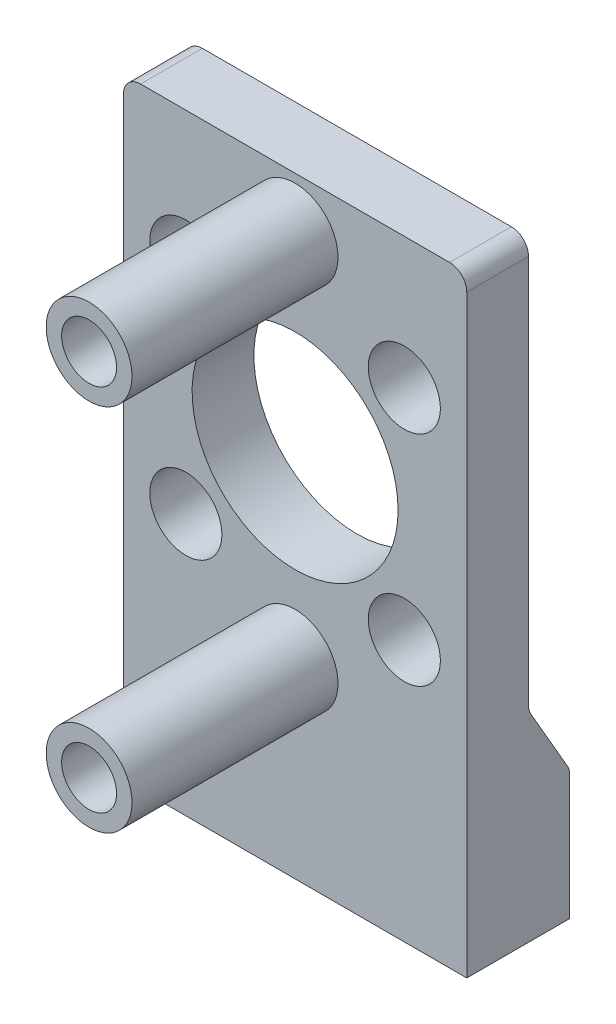
ISO-10303-21;
HEADER;
FILE_DESCRIPTION(('STEP AP214'),'2;1');
FILE_NAME('part.step','',(''),(''),'','','');
FILE_SCHEMA(('AUTOMOTIVE_DESIGN { 1 0 10303 214 1 1 1 1 }'));
ENDSEC;
DATA;
#1=APPLICATION_CONTEXT('core data for automotive mechanical design processes');
#2=APPLICATION_PROTOCOL_DEFINITION('international standard','automotive_design',2000,#1);
#3=PRODUCT_CONTEXT('',#1,'mechanical');
#4=PRODUCT('Part','Part','',(#3));
#5=PRODUCT_RELATED_PRODUCT_CATEGORY('part','',(#4));
#6=PRODUCT_DEFINITION_FORMATION('','',#4);
#7=PRODUCT_DEFINITION_CONTEXT('part definition',#1,'design');
#8=PRODUCT_DEFINITION('design','',#6,#7);
#9=PRODUCT_DEFINITION_SHAPE('','',#8);
#10=(LENGTH_UNIT() NAMED_UNIT(*) SI_UNIT(.MILLI.,.METRE.));
#11=(NAMED_UNIT(*) PLANE_ANGLE_UNIT() SI_UNIT($,.RADIAN.));
#12=(NAMED_UNIT(*) SI_UNIT($,.STERADIAN.) SOLID_ANGLE_UNIT());
#13=UNCERTAINTY_MEASURE_WITH_UNIT(LENGTH_MEASURE(1.E-05),#10,'distance_accuracy_value','');
#14=(GEOMETRIC_REPRESENTATION_CONTEXT(3) GLOBAL_UNCERTAINTY_ASSIGNED_CONTEXT((#13)) GLOBAL_UNIT_ASSIGNED_CONTEXT((#10,
#11,#12)) REPRESENTATION_CONTEXT('',''));
#15=CARTESIAN_POINT('',(0.,0.,0.));
#16=DIRECTION('',(0.,0.,1.));
#17=DIRECTION('',(1.,0.,0.));
#18=AXIS2_PLACEMENT_3D('',#15,#16,#17);
#19=CARTESIAN_POINT('',(-5.,-10.0827140549273,3.));
#20=DIRECTION('',(0.,1.,0.));
#21=DIRECTION('',(0.,0.,1.));
#22=AXIS2_PLACEMENT_3D('',#19,#20,#21);
#23=PLANE('',#22);
#24=CARTESIAN_POINT('',(-3.,-10.0827140549273,1.5));
#25=DIRECTION('',(0.,-1.,0.));
#26=DIRECTION('',(0.,0.,-1.));
#27=AXIS2_PLACEMENT_3D('',#24,#25,#26);
#28=CIRCLE('',#27,0.8);
#29=CARTESIAN_POINT('',(-3.,-10.0827140549273,0.7));
#30=VERTEX_POINT('',#29);
#31=EDGE_CURVE('E275',#30,#30,#28,.T.);
#32=ORIENTED_EDGE('',*,*,#31,.F.);
#33=EDGE_LOOP('',(#32));
#34=FACE_BOUND('',#33,.T.);
#35=DIRECTION('',(1.,0.,0.));
#36=VECTOR('',#35,1.);
#37=CARTESIAN_POINT('',(-5.,-10.0827140549273,0.));
#38=LINE('',#37,#36);
#39=CARTESIAN_POINT('',(-5.,-10.0827140549273,0.));
#40=VERTEX_POINT('',#39);
#41=CARTESIAN_POINT('',(5.,-10.0827140549273,0.));
#42=VERTEX_POINT('',#41);
#43=EDGE_CURVE('E236',#40,#42,#38,.T.);
#44=ORIENTED_EDGE('',*,*,#43,.T.);
#45=DIRECTION('',(0.,0.,-1.));
#46=VECTOR('',#45,1.);
#47=CARTESIAN_POINT('',(5.,-10.0827140549273,3.));
#48=LINE('',#47,#46);
#49=CARTESIAN_POINT('',(5.,-10.0827140549273,3.));
#50=VERTEX_POINT('',#49);
#51=EDGE_CURVE('E250',#50,#42,#48,.T.);
#52=ORIENTED_EDGE('',*,*,#51,.F.);
#53=DIRECTION('',(1.,0.,0.));
#54=VECTOR('',#53,1.);
#55=CARTESIAN_POINT('',(-5.,-10.0827140549273,3.));
#56=LINE('',#55,#54);
#57=CARTESIAN_POINT('',(-5.,-10.0827140549273,3.));
#58=VERTEX_POINT('',#57);
#59=EDGE_CURVE('E268',#58,#50,#56,.T.);
#60=ORIENTED_EDGE('',*,*,#59,.F.);
#61=DIRECTION('',(0.,0.,-1.));
#62=VECTOR('',#61,1.);
#63=CARTESIAN_POINT('',(-5.,-10.0827140549273,3.));
#64=LINE('',#63,#62);
#65=EDGE_CURVE('E253',#58,#40,#64,.T.);
#66=ORIENTED_EDGE('',*,*,#65,.T.);
#67=EDGE_LOOP('',(#44,#52,#60,#66));
#68=FACE_BOUND('',#67,.T.);
#69=CARTESIAN_POINT('',(3.,-10.0827140549273,1.5));
#70=DIRECTION('',(0.,1.,0.));
#71=DIRECTION('',(0.,0.,1.));
#72=AXIS2_PLACEMENT_3D('',#69,#70,#71);
#73=CIRCLE('',#72,0.8);
#74=CARTESIAN_POINT('',(3.,-10.0827140549273,2.3));
#75=VERTEX_POINT('',#74);
#76=EDGE_CURVE('E242',#75,#75,#73,.T.);
#77=ORIENTED_EDGE('',*,*,#76,.T.);
#78=EDGE_LOOP('',(#77));
#79=FACE_BOUND('',#78,.T.);
#80=ADVANCED_FACE('F41',(#34,#68,#79),#23,.F.);
#81=CARTESIAN_POINT('',(-5.,-9.78271405492731,3.));
#82=DIRECTION('',(1.,0.,0.));
#83=DIRECTION('',(0.,0.,-1.));
#84=AXIS2_PLACEMENT_3D('',#81,#82,#83);
#85=PLANE('',#84);
#86=DIRECTION('',(0.,-0.866025403784442,-0.499999999999995));
#87=VECTOR('',#86,1.);
#88=CARTESIAN_POINT('',(-5.,-4.24380333156708,1.2));
#89=LINE('',#88,#87);
#90=CARTESIAN_POINT('',(-5.,-4.35982873535151,1.13301270189222));
#91=VERTEX_POINT('',#90);
#92=CARTESIAN_POINT('',(-5.,-6.20623889686532,0.0669872981077782));
#93=VERTEX_POINT('',#92);
#94=EDGE_CURVE('E232',#91,#93,#89,.T.);
#95=ORIENTED_EDGE('',*,*,#94,.T.);
#96=CARTESIAN_POINT('',(-5.,-6.45623889686532,0.5));
#97=DIRECTION('',(1.,0.,0.));
#98=DIRECTION('',(0.,0.,-1.));
#99=AXIS2_PLACEMENT_3D('',#96,#97,#98);
#100=CIRCLE('',#99,0.5);
#101=CARTESIAN_POINT('',(-5.,-6.45623889686532,0.));
#102=VERTEX_POINT('',#101);
#103=EDGE_CURVE('E159',#93,#102,#100,.F.);
#104=ORIENTED_EDGE('',*,*,#103,.T.);
#105=DIRECTION('',(0.,-1.,0.));
#106=VECTOR('',#105,1.);
#107=CARTESIAN_POINT('',(-5.,-9.78271405492731,0.));
#108=LINE('',#107,#106);
#109=EDGE_CURVE('E230',#102,#40,#108,.T.);
#110=ORIENTED_EDGE('',*,*,#109,.T.);
#111=ORIENTED_EDGE('',*,*,#65,.F.);
#112=DIRECTION('',(0.,-1.,0.));
#113=VECTOR('',#112,1.);
#114=CARTESIAN_POINT('',(-5.,-9.78271405492731,3.));
#115=LINE('',#114,#113);
#116=CARTESIAN_POINT('',(-5.,7.2172859450727,3.));
#117=VERTEX_POINT('',#116);
#118=EDGE_CURVE('E249',#117,#58,#115,.T.);
#119=ORIENTED_EDGE('',*,*,#118,.F.);
#120=DIRECTION('',(0.,0.,-1.));
#121=VECTOR('',#120,1.);
#122=CARTESIAN_POINT('',(-5.,7.2172859450727,3.));
#123=LINE('',#122,#121);
#124=CARTESIAN_POINT('',(-5.,7.2172859450727,1.2));
#125=VERTEX_POINT('',#124);
#126=EDGE_CURVE('E255',#117,#125,#123,.T.);
#127=ORIENTED_EDGE('',*,*,#126,.T.);
#128=DIRECTION('',(0.,-1.,0.));
#129=VECTOR('',#128,1.);
#130=CARTESIAN_POINT('',(-5.,7.7172859450727,1.2));
#131=LINE('',#130,#129);
#132=CARTESIAN_POINT('',(-5.,-4.10982873535152,1.2));
#133=VERTEX_POINT('',#132);
#134=EDGE_CURVE('E313',#125,#133,#131,.T.);
#135=ORIENTED_EDGE('',*,*,#134,.T.);
#136=CARTESIAN_POINT('',(-5.,-4.10982873535152,0.699999999999998));
#137=DIRECTION('',(1.,0.,0.));
#138=DIRECTION('',(0.,0.,-1.));
#139=AXIS2_PLACEMENT_3D('',#136,#137,#138);
#140=CIRCLE('',#139,0.5);
#141=EDGE_CURVE('E163',#133,#91,#140,.T.);
#142=ORIENTED_EDGE('',*,*,#141,.T.);
#143=EDGE_LOOP('',(#95,#104,#110,#111,#119,#127,#135,#142));
#144=FACE_BOUND('',#143,.T.);
#145=ADVANCED_FACE('F195',(#144),#85,.F.);
#146=CARTESIAN_POINT('',(5.,-4.61241432740687,3.));
#147=DIRECTION('',(-1.,0.,0.));
#148=DIRECTION('',(0.,0.,1.));
#149=AXIS2_PLACEMENT_3D('',#146,#147,#148);
#150=PLANE('',#149);
#151=DIRECTION('',(0.,1.,0.));
#152=VECTOR('',#151,1.);
#153=CARTESIAN_POINT('',(5.,-4.61241432740687,0.));
#154=LINE('',#153,#152);
#155=CARTESIAN_POINT('',(5.,-6.45623889686532,0.));
#156=VERTEX_POINT('',#155);
#157=EDGE_CURVE('E239',#42,#156,#154,.T.);
#158=ORIENTED_EDGE('',*,*,#157,.T.);
#159=CARTESIAN_POINT('',(5.,-6.45623889686532,0.5));
#160=DIRECTION('',(-1.,0.,0.));
#161=DIRECTION('',(0.,0.,1.));
#162=AXIS2_PLACEMENT_3D('',#159,#160,#161);
#163=CIRCLE('',#162,0.5);
#164=CARTESIAN_POINT('',(5.,-6.20623889686532,0.0669872981077782));
#165=VERTEX_POINT('',#164);
#166=EDGE_CURVE('E153',#156,#165,#163,.F.);
#167=ORIENTED_EDGE('',*,*,#166,.T.);
#168=DIRECTION('',(0.,-0.866025403784442,-0.499999999999995));
#169=VECTOR('',#168,1.);
#170=CARTESIAN_POINT('',(5.,-4.24380333156708,1.2));
#171=LINE('',#170,#169);
#172=CARTESIAN_POINT('',(5.,-4.35982873535151,1.13301270189222));
#173=VERTEX_POINT('',#172);
#174=EDGE_CURVE('E140',#173,#165,#171,.T.);
#175=ORIENTED_EDGE('',*,*,#174,.F.);
#176=CARTESIAN_POINT('',(5.,-4.10982873535152,0.699999999999998));
#177=DIRECTION('',(-1.,0.,0.));
#178=DIRECTION('',(0.,0.,1.));
#179=AXIS2_PLACEMENT_3D('',#176,#177,#178);
#180=CIRCLE('',#179,0.5);
#181=CARTESIAN_POINT('',(5.,-4.10982873535152,1.2));
#182=VERTEX_POINT('',#181);
#183=EDGE_CURVE('E139',#173,#182,#180,.T.);
#184=ORIENTED_EDGE('',*,*,#183,.T.);
#185=DIRECTION('',(0.,-1.,0.));
#186=VECTOR('',#185,1.);
#187=CARTESIAN_POINT('',(5.,7.7172859450727,1.2));
#188=LINE('',#187,#186);
#189=CARTESIAN_POINT('',(5.,7.2172859450727,1.2));
#190=VERTEX_POINT('',#189);
#191=EDGE_CURVE('E123',#190,#182,#188,.T.);
#192=ORIENTED_EDGE('',*,*,#191,.F.);
#193=DIRECTION('',(0.,0.,-1.));
#194=VECTOR('',#193,1.);
#195=CARTESIAN_POINT('',(5.,7.2172859450727,3.));
#196=LINE('',#195,#194);
#197=CARTESIAN_POINT('',(5.,7.2172859450727,3.));
#198=VERTEX_POINT('',#197);
#199=EDGE_CURVE('E131',#190,#198,#196,.F.);
#200=ORIENTED_EDGE('',*,*,#199,.T.);
#201=DIRECTION('',(0.,1.,0.));
#202=VECTOR('',#201,1.);
#203=CARTESIAN_POINT('',(5.,-10.0827140549273,3.));
#204=LINE('',#203,#202);
#205=EDGE_CURVE('E265',#50,#198,#204,.T.);
#206=ORIENTED_EDGE('',*,*,#205,.F.);
#207=ORIENTED_EDGE('',*,*,#51,.T.);
#208=EDGE_LOOP('',(#158,#167,#175,#184,#192,#200,#206,#207));
#209=FACE_BOUND('',#208,.T.);
#210=ADVANCED_FACE('F135',(#209),#150,.F.);
#211=CARTESIAN_POINT('',(5.,7.7172859450727,3.));
#212=DIRECTION('',(0.,-1.,0.));
#213=DIRECTION('',(1.,0.,0.));
#214=AXIS2_PLACEMENT_3D('',#211,#212,#213);
#215=PLANE('',#214);
#216=DIRECTION('',(0.,0.,-1.));
#217=VECTOR('',#216,1.);
#218=CARTESIAN_POINT('',(4.5,7.7172859450727,3.));
#219=LINE('',#218,#217);
#220=CARTESIAN_POINT('',(4.5,7.7172859450727,3.));
#221=VERTEX_POINT('',#220);
#222=CARTESIAN_POINT('',(4.5,7.7172859450727,1.2));
#223=VERTEX_POINT('',#222);
#224=EDGE_CURVE('E258',#221,#223,#219,.T.);
#225=ORIENTED_EDGE('',*,*,#224,.T.);
#226=DIRECTION('',(1.,0.,0.));
#227=VECTOR('',#226,1.);
#228=CARTESIAN_POINT('',(-5.,7.7172859450727,1.2));
#229=LINE('',#228,#227);
#230=CARTESIAN_POINT('',(-4.5,7.7172859450727,1.2));
#231=VERTEX_POINT('',#230);
#232=EDGE_CURVE('E125',#231,#223,#229,.T.);
#233=ORIENTED_EDGE('',*,*,#232,.F.);
#234=DIRECTION('',(0.,0.,-1.));
#235=VECTOR('',#234,1.);
#236=CARTESIAN_POINT('',(-4.5,7.7172859450727,3.));
#237=LINE('',#236,#235);
#238=CARTESIAN_POINT('',(-4.5,7.7172859450727,3.));
#239=VERTEX_POINT('',#238);
#240=EDGE_CURVE('E260',#231,#239,#237,.F.);
#241=ORIENTED_EDGE('',*,*,#240,.T.);
#242=DIRECTION('',(-1.,0.,0.));
#243=VECTOR('',#242,1.);
#244=CARTESIAN_POINT('',(5.,7.7172859450727,3.));
#245=LINE('',#244,#243);
#246=EDGE_CURVE('E245',#221,#239,#245,.T.);
#247=ORIENTED_EDGE('',*,*,#246,.F.);
#248=EDGE_LOOP('',(#225,#233,#241,#247));
#249=FACE_BOUND('',#248,.T.);
#250=ADVANCED_FACE('F189',(#249),#215,.F.);
#251=CARTESIAN_POINT('',(0.,0.,3.));
#252=DIRECTION('',(0.,0.,1.));
#253=DIRECTION('',(1.,0.,0.));
#254=AXIS2_PLACEMENT_3D('',#251,#252,#253);
#255=PLANE('',#254);
#256=CARTESIAN_POINT('',(0.,6.2172859450727,3.));
#257=DIRECTION('',(0.,0.,1.));
#258=DIRECTION('',(1.,0.,0.));
#259=AXIS2_PLACEMENT_3D('',#256,#257,#258);
#260=CIRCLE('',#259,1.25);
#261=CARTESIAN_POINT('',(1.25,6.2172859450727,3.));
#262=VERTEX_POINT('',#261);
#263=EDGE_CURVE('E327',#262,#262,#260,.T.);
#264=ORIENTED_EDGE('',*,*,#263,.F.);
#265=EDGE_LOOP('',(#264));
#266=FACE_BOUND('',#265,.T.);
#267=CARTESIAN_POINT('',(0.,-4.5327140549273,3.));
#268=DIRECTION('',(0.,0.,1.));
#269=DIRECTION('',(1.,0.,0.));
#270=AXIS2_PLACEMENT_3D('',#267,#268,#269);
#271=CIRCLE('',#270,1.25);
#272=CARTESIAN_POINT('',(1.25,-4.5327140549273,3.));
#273=VERTEX_POINT('',#272);
#274=EDGE_CURVE('E321',#273,#273,#271,.T.);
#275=ORIENTED_EDGE('',*,*,#274,.F.);
#276=EDGE_LOOP('',(#275));
#277=FACE_BOUND('',#276,.T.);
#278=CARTESIAN_POINT('',(3.1819805153394,-2.46469457026674,3.));
#279=DIRECTION('',(0.,0.,1.));
#280=DIRECTION('',(1.,0.,0.));
#281=AXIS2_PLACEMENT_3D('',#278,#279,#280);
#282=CIRCLE('',#281,1.05);
#283=CARTESIAN_POINT('',(4.2319805153394,-2.46469457026674,3.));
#284=VERTEX_POINT('',#283);
#285=EDGE_CURVE('E276',#284,#284,#282,.T.);
#286=ORIENTED_EDGE('',*,*,#285,.F.);
#287=EDGE_LOOP('',(#286));
#288=FACE_BOUND('',#287,.T.);
#289=CARTESIAN_POINT('',(-3.18198051533954,-2.46469457026669,3.));
#290=DIRECTION('',(0.,0.,1.));
#291=DIRECTION('',(1.,0.,0.));
#292=AXIS2_PLACEMENT_3D('',#289,#290,#291);
#293=CIRCLE('',#292,1.05);
#294=CARTESIAN_POINT('',(-2.13198051533954,-2.46469457026669,3.));
#295=VERTEX_POINT('',#294);
#296=EDGE_CURVE('E283',#295,#295,#293,.T.);
#297=ORIENTED_EDGE('',*,*,#296,.F.);
#298=EDGE_LOOP('',(#297));
#299=FACE_BOUND('',#298,.T.);
#300=CARTESIAN_POINT('',(-3.1819805153394,3.89926646041213,3.));
#301=DIRECTION('',(0.,0.,1.));
#302=DIRECTION('',(1.,0.,0.));
#303=AXIS2_PLACEMENT_3D('',#300,#301,#302);
#304=CIRCLE('',#303,1.05000000000001);
#305=CARTESIAN_POINT('',(-2.13198051533939,3.89926646041213,3.));
#306=VERTEX_POINT('',#305);
#307=EDGE_CURVE('E286',#306,#306,#304,.T.);
#308=ORIENTED_EDGE('',*,*,#307,.F.);
#309=EDGE_LOOP('',(#308));
#310=FACE_BOUND('',#309,.T.);
#311=CARTESIAN_POINT('',(3.18198051533947,3.89926646041216,3.));
#312=DIRECTION('',(0.,0.,1.));
#313=DIRECTION('',(1.,0.,0.));
#314=AXIS2_PLACEMENT_3D('',#311,#312,#313);
#315=CIRCLE('',#314,1.05);
#316=CARTESIAN_POINT('',(4.23198051533947,3.89926646041216,3.));
#317=VERTEX_POINT('',#316);
#318=EDGE_CURVE('E289',#317,#317,#315,.T.);
#319=ORIENTED_EDGE('',*,*,#318,.F.);
#320=EDGE_LOOP('',(#319));
#321=FACE_BOUND('',#320,.T.);
#322=CARTESIAN_POINT('',(0.,0.717285945072699,3.));
#323=DIRECTION('',(0.,0.,1.));
#324=DIRECTION('',(1.,0.,0.));
#325=AXIS2_PLACEMENT_3D('',#322,#323,#324);
#326=CIRCLE('',#325,3.);
#327=CARTESIAN_POINT('',(3.,0.717285945072699,3.));
#328=VERTEX_POINT('',#327);
#329=EDGE_CURVE('E292',#328,#328,#326,.T.);
#330=ORIENTED_EDGE('',*,*,#329,.F.);
#331=EDGE_LOOP('',(#330));
#332=FACE_BOUND('',#331,.T.);
#333=ORIENTED_EDGE('',*,*,#246,.T.);
#334=CARTESIAN_POINT('',(-4.5,7.2172859450727,3.));
#335=DIRECTION('',(0.,0.,1.));
#336=DIRECTION('',(1.,0.,0.));
#337=AXIS2_PLACEMENT_3D('',#334,#335,#336);
#338=CIRCLE('',#337,0.5);
#339=EDGE_CURVE('E146',#239,#117,#338,.T.);
#340=ORIENTED_EDGE('',*,*,#339,.T.);
#341=ORIENTED_EDGE('',*,*,#118,.T.);
#342=ORIENTED_EDGE('',*,*,#59,.T.);
#343=ORIENTED_EDGE('',*,*,#205,.T.);
#344=CARTESIAN_POINT('',(4.5,7.2172859450727,3.));
#345=DIRECTION('',(0.,0.,1.));
#346=DIRECTION('',(1.,0.,0.));
#347=AXIS2_PLACEMENT_3D('',#344,#345,#346);
#348=CIRCLE('',#347,0.5);
#349=EDGE_CURVE('E145',#198,#221,#348,.T.);
#350=ORIENTED_EDGE('',*,*,#349,.T.);
#351=EDGE_LOOP('',(#333,#340,#341,#342,#343,#350));
#352=FACE_BOUND('',#351,.T.);
#353=ADVANCED_FACE('F173',(#266,#277,#288,#299,#310,#321,#332,#352),#255,.T.);
#354=CARTESIAN_POINT('',(0.,0.,0.));
#355=DIRECTION('',(0.,0.,1.));
#356=DIRECTION('',(1.,0.,0.));
#357=AXIS2_PLACEMENT_3D('',#354,#355,#356);
#358=PLANE('',#357);
#359=ORIENTED_EDGE('',*,*,#109,.F.);
#360=DIRECTION('',(1.,0.,0.));
#361=VECTOR('',#360,1.);
#362=CARTESIAN_POINT('',(0.,-6.45623889686532,0.));
#363=LINE('',#362,#361);
#364=EDGE_CURVE('E130',#102,#156,#363,.T.);
#365=ORIENTED_EDGE('',*,*,#364,.T.);
#366=ORIENTED_EDGE('',*,*,#157,.F.);
#367=ORIENTED_EDGE('',*,*,#43,.F.);
#368=EDGE_LOOP('',(#359,#365,#366,#367));
#369=FACE_BOUND('',#368,.T.);
#370=ADVANCED_FACE('F188',(#369),#358,.F.);
#371=CARTESIAN_POINT('',(-3.,-6.5827140549273,1.5));
#372=DIRECTION('',(0.,-1.,0.));
#373=DIRECTION('',(0.,0.,-1.));
#374=AXIS2_PLACEMENT_3D('',#371,#372,#373);
#375=CYLINDRICAL_SURFACE('',#374,0.8);
#376=CARTESIAN_POINT('',(-3.,-6.5827140549273,1.5));
#377=DIRECTION('',(0.,-1.,0.));
#378=DIRECTION('',(0.,0.,-1.));
#379=AXIS2_PLACEMENT_3D('',#376,#377,#378);
#380=CIRCLE('',#379,0.8);
#381=CARTESIAN_POINT('',(-3.,-6.5827140549273,0.7));
#382=VERTEX_POINT('',#381);
#383=EDGE_CURVE('E272',#382,#382,#380,.T.);
#384=ORIENTED_EDGE('',*,*,#383,.F.);
#385=EDGE_LOOP('',(#384));
#386=FACE_BOUND('',#385,.T.);
#387=ORIENTED_EDGE('',*,*,#31,.T.);
#388=EDGE_LOOP('',(#387));
#389=FACE_BOUND('',#388,.T.);
#390=ADVANCED_FACE('F383',(#386,#389),#375,.F.);
#391=CARTESIAN_POINT('',(-3.,-6.5827140549273,1.5));
#392=DIRECTION('',(0.,-1.,0.));
#393=DIRECTION('',(0.,0.,-1.));
#394=AXIS2_PLACEMENT_3D('',#391,#392,#393);
#395=PLANE('',#394);
#396=ORIENTED_EDGE('',*,*,#383,.T.);
#397=EDGE_LOOP('',(#396));
#398=FACE_BOUND('',#397,.T.);
#399=ADVANCED_FACE('F381',(#398),#395,.T.);
#400=CARTESIAN_POINT('',(3.,-6.5827140549273,1.5));
#401=DIRECTION('',(0.,-1.,0.));
#402=DIRECTION('',(0.,0.,-1.));
#403=AXIS2_PLACEMENT_3D('',#400,#401,#402);
#404=CYLINDRICAL_SURFACE('',#403,0.8);
#405=CARTESIAN_POINT('',(3.,-6.5827140549273,1.5));
#406=DIRECTION('',(0.,1.,0.));
#407=DIRECTION('',(0.,0.,1.));
#408=AXIS2_PLACEMENT_3D('',#405,#406,#407);
#409=CIRCLE('',#408,0.8);
#410=CARTESIAN_POINT('',(3.,-6.5827140549273,2.3));
#411=VERTEX_POINT('',#410);
#412=EDGE_CURVE('E237',#411,#411,#409,.T.);
#413=ORIENTED_EDGE('',*,*,#412,.T.);
#414=EDGE_LOOP('',(#413));
#415=FACE_BOUND('',#414,.T.);
#416=ORIENTED_EDGE('',*,*,#76,.F.);
#417=EDGE_LOOP('',(#416));
#418=FACE_BOUND('',#417,.T.);
#419=ADVANCED_FACE('F377',(#415,#418),#404,.F.);
#420=CARTESIAN_POINT('',(3.,-6.5827140549273,1.5));
#421=DIRECTION('',(0.,1.,0.));
#422=DIRECTION('',(0.,0.,1.));
#423=AXIS2_PLACEMENT_3D('',#420,#421,#422);
#424=PLANE('',#423);
#425=ORIENTED_EDGE('',*,*,#412,.F.);
#426=EDGE_LOOP('',(#425));
#427=FACE_BOUND('',#426,.T.);
#428=ADVANCED_FACE('F373',(#427),#424,.F.);
#429=CARTESIAN_POINT('',(0.,0.717285945072699,5.));
#430=DIRECTION('',(0.,0.,-1.));
#431=DIRECTION('',(-1.,0.,0.));
#432=AXIS2_PLACEMENT_3D('',#429,#430,#431);
#433=CYLINDRICAL_SURFACE('',#432,3.);
#434=CARTESIAN_POINT('',(0.,0.717285945072699,1.2));
#435=DIRECTION('',(0.,0.,1.));
#436=DIRECTION('',(0.,-1.,0.));
#437=AXIS2_PLACEMENT_3D('',#434,#435,#436);
#438=CIRCLE('',#437,3.);
#439=CARTESIAN_POINT('',(0.,-2.2827140549273,1.2));
#440=VERTEX_POINT('',#439);
#441=EDGE_CURVE('E295',#440,#440,#438,.F.);
#442=ORIENTED_EDGE('',*,*,#441,.T.);
#443=EDGE_LOOP('',(#442));
#444=FACE_BOUND('',#443,.T.);
#445=ORIENTED_EDGE('',*,*,#329,.T.);
#446=EDGE_LOOP('',(#445));
#447=FACE_BOUND('',#446,.T.);
#448=ADVANCED_FACE('F359',(#444,#447),#433,.F.);
#449=CARTESIAN_POINT('',(3.18198051533947,3.89926646041216,5.));
#450=DIRECTION('',(0.,0.,-1.));
#451=DIRECTION('',(-1.,0.,0.));
#452=AXIS2_PLACEMENT_3D('',#449,#450,#451);
#453=CYLINDRICAL_SURFACE('',#452,1.05);
#454=CARTESIAN_POINT('',(3.18198051533947,3.89926646041216,1.2));
#455=DIRECTION('',(0.,0.,1.));
#456=DIRECTION('',(0.,-1.,0.));
#457=AXIS2_PLACEMENT_3D('',#454,#455,#456);
#458=CIRCLE('',#457,1.05);
#459=CARTESIAN_POINT('',(3.18198051533947,2.84926646041216,1.2));
#460=VERTEX_POINT('',#459);
#461=EDGE_CURVE('E298',#460,#460,#458,.F.);
#462=ORIENTED_EDGE('',*,*,#461,.T.);
#463=EDGE_LOOP('',(#462));
#464=FACE_BOUND('',#463,.T.);
#465=ORIENTED_EDGE('',*,*,#318,.T.);
#466=EDGE_LOOP('',(#465));
#467=FACE_BOUND('',#466,.T.);
#468=ADVANCED_FACE('F355',(#464,#467),#453,.F.);
#469=CARTESIAN_POINT('',(-3.1819805153394,3.89926646041213,5.));
#470=DIRECTION('',(0.,0.,-1.));
#471=DIRECTION('',(-1.,0.,0.));
#472=AXIS2_PLACEMENT_3D('',#469,#470,#471);
#473=CYLINDRICAL_SURFACE('',#472,1.05000000000001);
#474=CARTESIAN_POINT('',(-3.1819805153394,3.89926646041213,1.2));
#475=DIRECTION('',(0.,0.,1.));
#476=DIRECTION('',(0.,-1.,0.));
#477=AXIS2_PLACEMENT_3D('',#474,#475,#476);
#478=CIRCLE('',#477,1.05000000000001);
#479=CARTESIAN_POINT('',(-3.1819805153394,2.84926646041213,1.2));
#480=VERTEX_POINT('',#479);
#481=EDGE_CURVE('E301',#480,#480,#478,.F.);
#482=ORIENTED_EDGE('',*,*,#481,.T.);
#483=EDGE_LOOP('',(#482));
#484=FACE_BOUND('',#483,.T.);
#485=ORIENTED_EDGE('',*,*,#307,.T.);
#486=EDGE_LOOP('',(#485));
#487=FACE_BOUND('',#486,.T.);
#488=ADVANCED_FACE('F358',(#484,#487),#473,.F.);
#489=CARTESIAN_POINT('',(-3.18198051533954,-2.46469457026669,5.));
#490=DIRECTION('',(0.,0.,-1.));
#491=DIRECTION('',(-1.,0.,0.));
#492=AXIS2_PLACEMENT_3D('',#489,#490,#491);
#493=CYLINDRICAL_SURFACE('',#492,1.05);
#494=CARTESIAN_POINT('',(-3.18198051533954,-2.46469457026669,1.2));
#495=DIRECTION('',(0.,0.,1.));
#496=DIRECTION('',(0.,-1.,0.));
#497=AXIS2_PLACEMENT_3D('',#494,#495,#496);
#498=CIRCLE('',#497,1.05);
#499=CARTESIAN_POINT('',(-3.18198051533954,-3.51469457026669,1.2));
#500=VERTEX_POINT('',#499);
#501=EDGE_CURVE('E304',#500,#500,#498,.F.);
#502=ORIENTED_EDGE('',*,*,#501,.T.);
#503=EDGE_LOOP('',(#502));
#504=FACE_BOUND('',#503,.T.);
#505=ORIENTED_EDGE('',*,*,#296,.T.);
#506=EDGE_LOOP('',(#505));
#507=FACE_BOUND('',#506,.T.);
#508=ADVANCED_FACE('F363',(#504,#507),#493,.F.);
#509=CARTESIAN_POINT('',(3.1819805153394,-2.46469457026674,5.));
#510=DIRECTION('',(0.,0.,-1.));
#511=DIRECTION('',(-1.,0.,0.));
#512=AXIS2_PLACEMENT_3D('',#509,#510,#511);
#513=CYLINDRICAL_SURFACE('',#512,1.05);
#514=CARTESIAN_POINT('',(3.1819805153394,-2.46469457026674,1.2));
#515=DIRECTION('',(0.,0.,1.));
#516=DIRECTION('',(0.,-1.,0.));
#517=AXIS2_PLACEMENT_3D('',#514,#515,#516);
#518=CIRCLE('',#517,1.05);
#519=CARTESIAN_POINT('',(3.1819805153394,-3.51469457026674,1.2));
#520=VERTEX_POINT('',#519);
#521=EDGE_CURVE('E307',#520,#520,#518,.F.);
#522=ORIENTED_EDGE('',*,*,#521,.T.);
#523=EDGE_LOOP('',(#522));
#524=FACE_BOUND('',#523,.T.);
#525=ORIENTED_EDGE('',*,*,#285,.T.);
#526=EDGE_LOOP('',(#525));
#527=FACE_BOUND('',#526,.T.);
#528=ADVANCED_FACE('F212',(#524,#527),#513,.F.);
#529=CARTESIAN_POINT('',(-4.5,7.2172859450727,3.));
#530=DIRECTION('',(0.,0.,-1.));
#531=DIRECTION('',(-1.,0.,0.));
#532=AXIS2_PLACEMENT_3D('',#529,#530,#531);
#533=CYLINDRICAL_SURFACE('',#532,0.5);
#534=CARTESIAN_POINT('',(-4.5,7.2172859450727,1.2));
#535=DIRECTION('',(0.,0.,1.));
#536=DIRECTION('',(0.,-1.,0.));
#537=AXIS2_PLACEMENT_3D('',#534,#535,#536);
#538=CIRCLE('',#537,0.5);
#539=EDGE_CURVE('E310',#125,#231,#538,.F.);
#540=ORIENTED_EDGE('',*,*,#539,.F.);
#541=ORIENTED_EDGE('',*,*,#126,.F.);
#542=ORIENTED_EDGE('',*,*,#339,.F.);
#543=ORIENTED_EDGE('',*,*,#240,.F.);
#544=EDGE_LOOP('',(#540,#541,#542,#543));
#545=FACE_BOUND('',#544,.T.);
#546=ADVANCED_FACE('F209',(#545),#533,.T.);
#547=CARTESIAN_POINT('',(4.5,7.2172859450727,3.));
#548=DIRECTION('',(0.,0.,-1.));
#549=DIRECTION('',(-1.,0.,0.));
#550=AXIS2_PLACEMENT_3D('',#547,#548,#549);
#551=CYLINDRICAL_SURFACE('',#550,0.5);
#552=CARTESIAN_POINT('',(4.5,7.2172859450727,1.2));
#553=DIRECTION('',(0.,0.,1.));
#554=DIRECTION('',(0.,-1.,0.));
#555=AXIS2_PLACEMENT_3D('',#552,#553,#554);
#556=CIRCLE('',#555,0.5);
#557=EDGE_CURVE('E119',#223,#190,#556,.F.);
#558=ORIENTED_EDGE('',*,*,#557,.F.);
#559=ORIENTED_EDGE('',*,*,#224,.F.);
#560=ORIENTED_EDGE('',*,*,#349,.F.);
#561=ORIENTED_EDGE('',*,*,#199,.F.);
#562=EDGE_LOOP('',(#558,#559,#560,#561));
#563=FACE_BOUND('',#562,.T.);
#564=ADVANCED_FACE('F144',(#563),#551,.T.);
#565=CARTESIAN_POINT('',(-5.,7.7172859450727,1.2));
#566=DIRECTION('',(0.,0.,1.));
#567=DIRECTION('',(0.,-1.,0.));
#568=AXIS2_PLACEMENT_3D('',#565,#566,#567);
#569=PLANE('',#568);
#570=ORIENTED_EDGE('',*,*,#461,.F.);
#571=EDGE_LOOP('',(#570));
#572=FACE_BOUND('',#571,.T.);
#573=ORIENTED_EDGE('',*,*,#501,.F.);
#574=EDGE_LOOP('',(#573));
#575=FACE_BOUND('',#574,.T.);
#576=ORIENTED_EDGE('',*,*,#191,.T.);
#577=DIRECTION('',(1.,0.,0.));
#578=VECTOR('',#577,1.);
#579=CARTESIAN_POINT('',(-5.,-4.10982873535152,1.2));
#580=LINE('',#579,#578);
#581=EDGE_CURVE('E56',#182,#133,#580,.F.);
#582=ORIENTED_EDGE('',*,*,#581,.T.);
#583=ORIENTED_EDGE('',*,*,#134,.F.);
#584=ORIENTED_EDGE('',*,*,#539,.T.);
#585=ORIENTED_EDGE('',*,*,#232,.T.);
#586=ORIENTED_EDGE('',*,*,#557,.T.);
#587=EDGE_LOOP('',(#576,#582,#583,#584,#585,#586));
#588=FACE_BOUND('',#587,.T.);
#589=ORIENTED_EDGE('',*,*,#521,.F.);
#590=EDGE_LOOP('',(#589));
#591=FACE_BOUND('',#590,.T.);
#592=ORIENTED_EDGE('',*,*,#481,.F.);
#593=EDGE_LOOP('',(#592));
#594=FACE_BOUND('',#593,.T.);
#595=ORIENTED_EDGE('',*,*,#441,.F.);
#596=EDGE_LOOP('',(#595));
#597=FACE_BOUND('',#596,.T.);
#598=ADVANCED_FACE('F121',(#572,#575,#588,#591,#594,#597),#569,.F.);
#599=CARTESIAN_POINT('',(-5.,-4.24380333156708,1.2));
#600=DIRECTION('',(0.,-0.499999999999995,0.866025403784442));
#601=DIRECTION('',(0.,-0.866025403784441,-0.499999999999995));
#602=AXIS2_PLACEMENT_3D('',#599,#600,#601);
#603=PLANE('',#602);
#604=ORIENTED_EDGE('',*,*,#174,.T.);
#605=DIRECTION('',(1.,0.,0.));
#606=VECTOR('',#605,1.);
#607=CARTESIAN_POINT('',(-5.,-6.20623889686532,0.0669872981077784));
#608=LINE('',#607,#606);
#609=EDGE_CURVE('E64',#165,#93,#608,.F.);
#610=ORIENTED_EDGE('',*,*,#609,.T.);
#611=ORIENTED_EDGE('',*,*,#94,.F.);
#612=DIRECTION('',(1.,0.,0.));
#613=VECTOR('',#612,1.);
#614=CARTESIAN_POINT('',(5.,-4.35982873535151,1.13301270189222));
#615=LINE('',#614,#613);
#616=EDGE_CURVE('E155',#91,#173,#615,.T.);
#617=ORIENTED_EDGE('',*,*,#616,.T.);
#618=EDGE_LOOP('',(#604,#610,#611,#617));
#619=FACE_BOUND('',#618,.T.);
#620=ADVANCED_FACE('F217',(#619),#603,.F.);
#621=CARTESIAN_POINT('',(0.,-6.45623889686532,0.5));
#622=DIRECTION('',(1.,0.,0.));
#623=DIRECTION('',(0.,0.,-1.));
#624=AXIS2_PLACEMENT_3D('',#621,#622,#623);
#625=CYLINDRICAL_SURFACE('',#624,0.5);
#626=ORIENTED_EDGE('',*,*,#103,.F.);
#627=ORIENTED_EDGE('',*,*,#609,.F.);
#628=ORIENTED_EDGE('',*,*,#166,.F.);
#629=ORIENTED_EDGE('',*,*,#364,.F.);
#630=EDGE_LOOP('',(#626,#627,#628,#629));
#631=FACE_BOUND('',#630,.T.);
#632=ADVANCED_FACE('F215',(#631),#625,.T.);
#633=CARTESIAN_POINT('',(-5.,-4.10982873535152,0.699999999999998));
#634=DIRECTION('',(-1.,0.,0.));
#635=DIRECTION('',(0.,0.,1.));
#636=AXIS2_PLACEMENT_3D('',#633,#634,#635);
#637=CYLINDRICAL_SURFACE('',#636,0.5);
#638=ORIENTED_EDGE('',*,*,#141,.F.);
#639=ORIENTED_EDGE('',*,*,#581,.F.);
#640=ORIENTED_EDGE('',*,*,#183,.F.);
#641=ORIENTED_EDGE('',*,*,#616,.F.);
#642=EDGE_LOOP('',(#638,#639,#640,#641));
#643=FACE_BOUND('',#642,.T.);
#644=ADVANCED_FACE('F43',(#643),#637,.F.);
#645=CARTESIAN_POINT('',(0.,-4.5327140549273,9.));
#646=DIRECTION('',(0.,0.,1.));
#647=DIRECTION('',(1.,0.,0.));
#648=AXIS2_PLACEMENT_3D('',#645,#646,#647);
#649=PLANE('',#648);
#650=CARTESIAN_POINT('',(0.,-4.5327140549273,9.));
#651=DIRECTION('',(0.,0.,1.));
#652=DIRECTION('',(1.,0.,0.));
#653=AXIS2_PLACEMENT_3D('',#650,#651,#652);
#654=CIRCLE('',#653,1.25);
#655=CARTESIAN_POINT('',(1.25,-4.5327140549273,9.));
#656=VERTEX_POINT('',#655);
#657=EDGE_CURVE('E322',#656,#656,#654,.T.);
#658=ORIENTED_EDGE('',*,*,#657,.T.);
#659=EDGE_LOOP('',(#658));
#660=FACE_BOUND('',#659,.T.);
#661=CARTESIAN_POINT('',(0.,-4.5327140549273,9.));
#662=DIRECTION('',(0.,0.,1.));
#663=DIRECTION('',(1.,0.,0.));
#664=AXIS2_PLACEMENT_3D('',#661,#662,#663);
#665=CIRCLE('',#664,0.8);
#666=CARTESIAN_POINT('',(0.8,-4.5327140549273,9.));
#667=VERTEX_POINT('',#666);
#668=EDGE_CURVE('E317',#667,#667,#665,.T.);
#669=ORIENTED_EDGE('',*,*,#668,.F.);
#670=EDGE_LOOP('',(#669));
#671=FACE_BOUND('',#670,.T.);
#672=ADVANCED_FACE('F223',(#660,#671),#649,.T.);
#673=CARTESIAN_POINT('',(0.,-4.5327140549273,9.));
#674=DIRECTION('',(0.,0.,-1.));
#675=DIRECTION('',(-1.,0.,0.));
#676=AXIS2_PLACEMENT_3D('',#673,#674,#675);
#677=CYLINDRICAL_SURFACE('',#676,1.25);
#678=ORIENTED_EDGE('',*,*,#657,.F.);
#679=EDGE_LOOP('',(#678));
#680=FACE_BOUND('',#679,.T.);
#681=ORIENTED_EDGE('',*,*,#274,.T.);
#682=EDGE_LOOP('',(#681));
#683=FACE_BOUND('',#682,.T.);
#684=ADVANCED_FACE('F182',(#680,#683),#677,.T.);
#685=CARTESIAN_POINT('',(0.,-4.5327140549273,9.));
#686=DIRECTION('',(0.,0.,-1.));
#687=DIRECTION('',(-1.,0.,0.));
#688=AXIS2_PLACEMENT_3D('',#685,#686,#687);
#689=CYLINDRICAL_SURFACE('',#688,0.8);
#690=ORIENTED_EDGE('',*,*,#668,.T.);
#691=EDGE_LOOP('',(#690));
#692=FACE_BOUND('',#691,.T.);
#693=CARTESIAN_POINT('',(0.,-4.5327140549273,3.));
#694=DIRECTION('',(0.,0.,1.));
#695=DIRECTION('',(1.,0.,0.));
#696=AXIS2_PLACEMENT_3D('',#693,#694,#695);
#697=CIRCLE('',#696,0.8);
#698=CARTESIAN_POINT('',(0.8,-4.5327140549273,3.));
#699=VERTEX_POINT('',#698);
#700=EDGE_CURVE('E49',#699,#699,#697,.F.);
#701=ORIENTED_EDGE('',*,*,#700,.T.);
#702=EDGE_LOOP('',(#701));
#703=FACE_BOUND('',#702,.T.);
#704=ADVANCED_FACE('F167',(#692,#703),#689,.F.);
#705=ORIENTED_EDGE('',*,*,#700,.F.);
#706=EDGE_LOOP('',(#705));
#707=FACE_BOUND('',#706,.T.);
#708=ADVANCED_FACE('F169',(#707),#255,.T.);
#709=CARTESIAN_POINT('',(0.,6.2172859450727,9.));
#710=DIRECTION('',(0.,0.,1.));
#711=DIRECTION('',(1.,0.,0.));
#712=AXIS2_PLACEMENT_3D('',#709,#710,#711);
#713=PLANE('',#712);
#714=CARTESIAN_POINT('',(0.,6.2172859450727,9.));
#715=DIRECTION('',(0.,0.,1.));
#716=DIRECTION('',(1.,0.,0.));
#717=AXIS2_PLACEMENT_3D('',#714,#715,#716);
#718=CIRCLE('',#717,1.25);
#719=CARTESIAN_POINT('',(1.25,6.2172859450727,9.));
#720=VERTEX_POINT('',#719);
#721=EDGE_CURVE('E141',#720,#720,#718,.T.);
#722=ORIENTED_EDGE('',*,*,#721,.T.);
#723=EDGE_LOOP('',(#722));
#724=FACE_BOUND('',#723,.T.);
#725=CARTESIAN_POINT('',(0.,6.2172859450727,9.));
#726=DIRECTION('',(0.,0.,1.));
#727=DIRECTION('',(1.,0.,0.));
#728=AXIS2_PLACEMENT_3D('',#725,#726,#727);
#729=CIRCLE('',#728,0.799999999999999);
#730=CARTESIAN_POINT('',(0.799999999999999,6.2172859450727,9.));
#731=VERTEX_POINT('',#730);
#732=EDGE_CURVE('E320',#731,#731,#729,.T.);
#733=ORIENTED_EDGE('',*,*,#732,.F.);
#734=EDGE_LOOP('',(#733));
#735=FACE_BOUND('',#734,.T.);
#736=ADVANCED_FACE('F171',(#724,#735),#713,.T.);
#737=CARTESIAN_POINT('',(0.,6.2172859450727,9.));
#738=DIRECTION('',(0.,0.,-1.));
#739=DIRECTION('',(-1.,0.,0.));
#740=AXIS2_PLACEMENT_3D('',#737,#738,#739);
#741=CYLINDRICAL_SURFACE('',#740,1.25);
#742=ORIENTED_EDGE('',*,*,#721,.F.);
#743=EDGE_LOOP('',(#742));
#744=FACE_BOUND('',#743,.T.);
#745=ORIENTED_EDGE('',*,*,#263,.T.);
#746=EDGE_LOOP('',(#745));
#747=FACE_BOUND('',#746,.T.);
#748=ADVANCED_FACE('F179',(#744,#747),#741,.T.);
#749=CARTESIAN_POINT('',(0.,6.2172859450727,9.));
#750=DIRECTION('',(0.,0.,-1.));
#751=DIRECTION('',(-1.,0.,0.));
#752=AXIS2_PLACEMENT_3D('',#749,#750,#751);
#753=CYLINDRICAL_SURFACE('',#752,0.799999999999999);
#754=ORIENTED_EDGE('',*,*,#732,.T.);
#755=EDGE_LOOP('',(#754));
#756=FACE_BOUND('',#755,.T.);
#757=CARTESIAN_POINT('',(0.,6.2172859450727,3.));
#758=DIRECTION('',(0.,0.,1.));
#759=DIRECTION('',(1.,0.,0.));
#760=AXIS2_PLACEMENT_3D('',#757,#758,#759);
#761=CIRCLE('',#760,0.799999999999999);
#762=CARTESIAN_POINT('',(0.799999999999999,6.2172859450727,3.));
#763=VERTEX_POINT('',#762);
#764=EDGE_CURVE('E11',#763,#763,#761,.F.);
#765=ORIENTED_EDGE('',*,*,#764,.T.);
#766=EDGE_LOOP('',(#765));
#767=FACE_BOUND('',#766,.T.);
#768=ADVANCED_FACE('F192',(#756,#767),#753,.F.);
#769=ORIENTED_EDGE('',*,*,#764,.F.);
#770=EDGE_LOOP('',(#769));
#771=FACE_BOUND('',#770,.T.);
#772=ADVANCED_FACE('F174',(#771),#255,.T.);
#773=CLOSED_SHELL('',(#80,#145,#210,#250,#353,#370,#390,#399,#419,#428,#448,#468,#488,#508,#528,
#546,#564,#598,#620,#632,#644,#672,#684,#704,#708,#736,#748,#768,#772));
#774=MANIFOLD_SOLID_BREP('B2',#773);
#775=ADVANCED_BREP_SHAPE_REPRESENTATION('',(#18,#774),#14);
#776=SHAPE_DEFINITION_REPRESENTATION(#9,#775);
ENDSEC;
END-ISO-10303-21;
